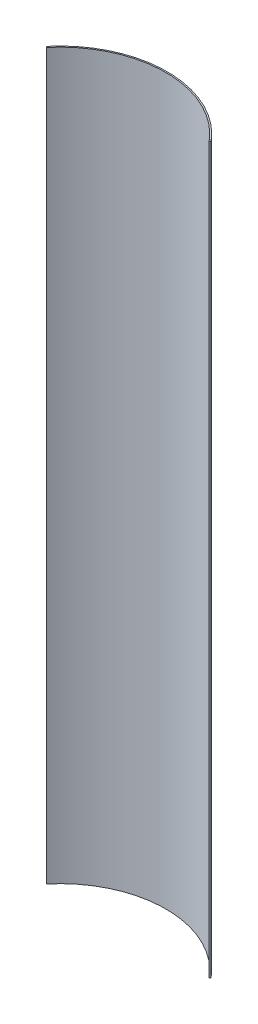
ISO-10303-21;
HEADER;
FILE_DESCRIPTION(('STEP AP214'),'2;1');
FILE_NAME('part.step','',(''),(''),'','','');
FILE_SCHEMA(('AUTOMOTIVE_DESIGN { 1 0 10303 214 1 1 1 1 }'));
ENDSEC;
DATA;
#1=APPLICATION_CONTEXT('core data for automotive mechanical design processes');
#2=APPLICATION_PROTOCOL_DEFINITION('international standard','automotive_design',2000,#1);
#3=PRODUCT_CONTEXT('',#1,'mechanical');
#4=PRODUCT('Part','Part','',(#3));
#5=PRODUCT_RELATED_PRODUCT_CATEGORY('part','',(#4));
#6=PRODUCT_DEFINITION_FORMATION('','',#4);
#7=PRODUCT_DEFINITION_CONTEXT('part definition',#1,'design');
#8=PRODUCT_DEFINITION('design','',#6,#7);
#9=PRODUCT_DEFINITION_SHAPE('','',#8);
#10=(LENGTH_UNIT() NAMED_UNIT(*) SI_UNIT(.MILLI.,.METRE.));
#11=(NAMED_UNIT(*) PLANE_ANGLE_UNIT() SI_UNIT($,.RADIAN.));
#12=(NAMED_UNIT(*) SI_UNIT($,.STERADIAN.) SOLID_ANGLE_UNIT());
#13=UNCERTAINTY_MEASURE_WITH_UNIT(LENGTH_MEASURE(1.E-05),#10,'distance_accuracy_value','');
#14=(GEOMETRIC_REPRESENTATION_CONTEXT(3) GLOBAL_UNCERTAINTY_ASSIGNED_CONTEXT((#13)) GLOBAL_UNIT_ASSIGNED_CONTEXT((#10,
#11,#12)) REPRESENTATION_CONTEXT('',''));
#15=CARTESIAN_POINT('',(0.,0.,0.));
#16=DIRECTION('',(0.,0.,1.));
#17=DIRECTION('',(1.,0.,0.));
#18=AXIS2_PLACEMENT_3D('',#15,#16,#17);
#19=CARTESIAN_POINT('',(0.,135.,0.));
#20=DIRECTION('',(0.,-1.,0.));
#21=DIRECTION('',(0.,0.,-1.));
#22=AXIS2_PLACEMENT_3D('',#19,#20,#21);
#23=CYLINDRICAL_SURFACE('',#22,20.);
#24=CARTESIAN_POINT('',(0.,0.,0.));
#25=DIRECTION('',(0.,1.,0.));
#26=DIRECTION('',(0.,0.,-1.));
#27=AXIS2_PLACEMENT_3D('',#24,#25,#26);
#28=CIRCLE('',#27,20.);
#29=CARTESIAN_POINT('',(15.3508684619239,0.,-12.8199390585411));
#30=VERTEX_POINT('',#29);
#31=CARTESIAN_POINT('',(-15.3508684619239,0.,-12.8199390585411));
#32=VERTEX_POINT('',#31);
#33=EDGE_CURVE('E104',#30,#32,#28,.T.);
#34=ORIENTED_EDGE('',*,*,#33,.T.);
#35=DIRECTION('',(0.,-1.,0.));
#36=VECTOR('',#35,1.);
#37=CARTESIAN_POINT('',(-15.3508684619239,135.,-12.8199390585411));
#38=LINE('',#37,#36);
#39=CARTESIAN_POINT('',(-15.3508684619239,135.,-12.8199390585411));
#40=VERTEX_POINT('',#39);
#41=EDGE_CURVE('E11',#40,#32,#38,.T.);
#42=ORIENTED_EDGE('',*,*,#41,.F.);
#43=CARTESIAN_POINT('',(0.,135.,0.));
#44=DIRECTION('',(0.,1.,0.));
#45=DIRECTION('',(0.,0.,-1.));
#46=AXIS2_PLACEMENT_3D('',#43,#44,#45);
#47=CIRCLE('',#46,20.);
#48=CARTESIAN_POINT('',(15.3508684619239,135.,-12.8199390585411));
#49=VERTEX_POINT('',#48);
#50=EDGE_CURVE('E92',#49,#40,#47,.T.);
#51=ORIENTED_EDGE('',*,*,#50,.F.);
#52=DIRECTION('',(0.,-1.,0.));
#53=VECTOR('',#52,1.);
#54=CARTESIAN_POINT('',(15.3508684619239,135.,-12.8199390585411));
#55=LINE('',#54,#53);
#56=EDGE_CURVE('E100',#49,#30,#55,.T.);
#57=ORIENTED_EDGE('',*,*,#56,.T.);
#58=EDGE_LOOP('',(#34,#42,#51,#57));
#59=FACE_BOUND('',#58,.T.);
#60=ADVANCED_FACE('F41',(#59),#23,.T.);
#61=CARTESIAN_POINT('',(-15.3508684619239,135.,-12.8199390585411));
#62=DIRECTION('',(0.640996952927052,0.,-0.767543423096202));
#63=DIRECTION('',(-0.767543423096202,0.,-0.640996952927052));
#64=AXIS2_PLACEMENT_3D('',#61,#62,#63);
#65=PLANE('',#64);
#66=DIRECTION('',(0.767543423096202,0.,0.640996952927052));
#67=VECTOR('',#66,1.);
#68=CARTESIAN_POINT('',(-15.3508684619239,0.,-12.8199390585411));
#69=LINE('',#68,#67);
#70=CARTESIAN_POINT('',(-15.1559124324575,0.,-12.6571258324977));
#71=VERTEX_POINT('',#70);
#72=EDGE_CURVE('E96',#32,#71,#69,.T.);
#73=ORIENTED_EDGE('',*,*,#72,.T.);
#74=DIRECTION('',(0.,-1.,0.));
#75=VECTOR('',#74,1.);
#76=CARTESIAN_POINT('',(-15.1559124324575,135.,-12.6571258324977));
#77=LINE('',#76,#75);
#78=CARTESIAN_POINT('',(-15.1559124324575,135.,-12.6571258324977));
#79=VERTEX_POINT('',#78);
#80=EDGE_CURVE('E49',#79,#71,#77,.T.);
#81=ORIENTED_EDGE('',*,*,#80,.F.);
#82=DIRECTION('',(0.767543423096202,0.,0.640996952927052));
#83=VECTOR('',#82,1.);
#84=CARTESIAN_POINT('',(-15.3508684619239,135.,-12.8199390585411));
#85=LINE('',#84,#83);
#86=EDGE_CURVE('E87',#40,#79,#85,.T.);
#87=ORIENTED_EDGE('',*,*,#86,.F.);
#88=ORIENTED_EDGE('',*,*,#41,.T.);
#89=EDGE_LOOP('',(#73,#81,#87,#88));
#90=FACE_BOUND('',#89,.T.);
#91=ADVANCED_FACE('F95',(#90),#65,.F.);
#92=CARTESIAN_POINT('',(0.,135.,0.));
#93=DIRECTION('',(0.,-1.,0.));
#94=DIRECTION('',(0.,0.,-1.));
#95=AXIS2_PLACEMENT_3D('',#92,#93,#94);
#96=CYLINDRICAL_SURFACE('',#95,19.746);
#97=CARTESIAN_POINT('',(0.,0.,0.));
#98=DIRECTION('',(0.,-1.,0.));
#99=DIRECTION('',(0.,0.,-1.));
#100=AXIS2_PLACEMENT_3D('',#97,#98,#99);
#101=CIRCLE('',#100,19.746);
#102=CARTESIAN_POINT('',(15.1559124324575,0.,-12.6571258324977));
#103=VERTEX_POINT('',#102);
#104=EDGE_CURVE('E74',#71,#103,#101,.T.);
#105=ORIENTED_EDGE('',*,*,#104,.T.);
#106=DIRECTION('',(0.,-1.,0.));
#107=VECTOR('',#106,1.);
#108=CARTESIAN_POINT('',(15.1559124324575,135.,-12.6571258324977));
#109=LINE('',#108,#107);
#110=CARTESIAN_POINT('',(15.1559124324575,135.,-12.6571258324977));
#111=VERTEX_POINT('',#110);
#112=EDGE_CURVE('E97',#111,#103,#109,.T.);
#113=ORIENTED_EDGE('',*,*,#112,.F.);
#114=CARTESIAN_POINT('',(0.,135.,0.));
#115=DIRECTION('',(0.,-1.,0.));
#116=DIRECTION('',(0.,0.,-1.));
#117=AXIS2_PLACEMENT_3D('',#114,#115,#116);
#118=CIRCLE('',#117,19.746);
#119=EDGE_CURVE('E90',#79,#111,#118,.T.);
#120=ORIENTED_EDGE('',*,*,#119,.F.);
#121=ORIENTED_EDGE('',*,*,#80,.T.);
#122=EDGE_LOOP('',(#105,#113,#120,#121));
#123=FACE_BOUND('',#122,.T.);
#124=ADVANCED_FACE('F98',(#123),#96,.F.);
#125=CARTESIAN_POINT('',(15.3508684619239,135.,-12.8199390585411));
#126=DIRECTION('',(-0.640996952927056,0.,-0.767543423096198));
#127=DIRECTION('',(-0.767543423096198,0.,0.640996952927056));
#128=AXIS2_PLACEMENT_3D('',#125,#126,#127);
#129=PLANE('',#128);
#130=DIRECTION('',(0.767543423096198,0.,-0.640996952927056));
#131=VECTOR('',#130,1.);
#132=CARTESIAN_POINT('',(15.3508684619239,0.,-12.8199390585411));
#133=LINE('',#132,#131);
#134=EDGE_CURVE('E80',#103,#30,#133,.T.);
#135=ORIENTED_EDGE('',*,*,#134,.T.);
#136=ORIENTED_EDGE('',*,*,#56,.F.);
#137=DIRECTION('',(0.767543423096198,0.,-0.640996952927056));
#138=VECTOR('',#137,1.);
#139=CARTESIAN_POINT('',(15.3508684619239,135.,-12.8199390585411));
#140=LINE('',#139,#138);
#141=EDGE_CURVE('E57',#111,#49,#140,.T.);
#142=ORIENTED_EDGE('',*,*,#141,.F.);
#143=ORIENTED_EDGE('',*,*,#112,.T.);
#144=EDGE_LOOP('',(#135,#136,#142,#143));
#145=FACE_BOUND('',#144,.T.);
#146=ADVANCED_FACE('F111',(#145),#129,.F.);
#147=CARTESIAN_POINT('',(0.,135.,0.));
#148=DIRECTION('',(0.,-1.,0.));
#149=DIRECTION('',(0.,0.,-1.));
#150=AXIS2_PLACEMENT_3D('',#147,#148,#149);
#151=PLANE('',#150);
#152=ORIENTED_EDGE('',*,*,#50,.T.);
#153=ORIENTED_EDGE('',*,*,#86,.T.);
#154=ORIENTED_EDGE('',*,*,#119,.T.);
#155=ORIENTED_EDGE('',*,*,#141,.T.);
#156=EDGE_LOOP('',(#152,#153,#154,#155));
#157=FACE_BOUND('',#156,.T.);
#158=ADVANCED_FACE('F88',(#157),#151,.F.);
#159=CARTESIAN_POINT('',(0.,0.,0.));
#160=DIRECTION('',(0.,-1.,0.));
#161=DIRECTION('',(0.,0.,-1.));
#162=AXIS2_PLACEMENT_3D('',#159,#160,#161);
#163=PLANE('',#162);
#164=ORIENTED_EDGE('',*,*,#33,.F.);
#165=ORIENTED_EDGE('',*,*,#134,.F.);
#166=ORIENTED_EDGE('',*,*,#104,.F.);
#167=ORIENTED_EDGE('',*,*,#72,.F.);
#168=EDGE_LOOP('',(#164,#165,#166,#167));
#169=FACE_BOUND('',#168,.T.);
#170=ADVANCED_FACE('F114',(#169),#163,.T.);
#171=CLOSED_SHELL('',(#60,#91,#124,#146,#158,#170));
#172=MANIFOLD_SOLID_BREP('B2',#171);
#173=ADVANCED_BREP_SHAPE_REPRESENTATION('',(#18,#172),#14);
#174=SHAPE_DEFINITION_REPRESENTATION(#9,#173);
ENDSEC;
END-ISO-10303-21;
